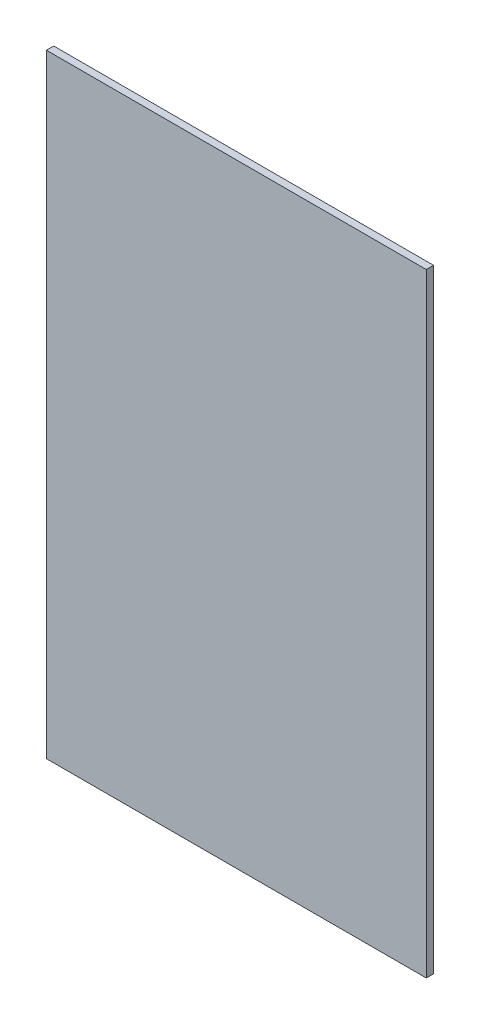
ISO-10303-21;
HEADER;
FILE_DESCRIPTION(('STEP AP214'),'2;1');
FILE_NAME('part.step','',(''),(''),'','','');
FILE_SCHEMA(('AUTOMOTIVE_DESIGN { 1 0 10303 214 1 1 1 1 }'));
ENDSEC;
DATA;
#1=APPLICATION_CONTEXT('core data for automotive mechanical design processes');
#2=APPLICATION_PROTOCOL_DEFINITION('international standard','automotive_design',2000,#1);
#3=PRODUCT_CONTEXT('',#1,'mechanical');
#4=PRODUCT('Part','Part','',(#3));
#5=PRODUCT_RELATED_PRODUCT_CATEGORY('part','',(#4));
#6=PRODUCT_DEFINITION_FORMATION('','',#4);
#7=PRODUCT_DEFINITION_CONTEXT('part definition',#1,'design');
#8=PRODUCT_DEFINITION('design','',#6,#7);
#9=PRODUCT_DEFINITION_SHAPE('','',#8);
#10=(LENGTH_UNIT() NAMED_UNIT(*) SI_UNIT(.MILLI.,.METRE.));
#11=(NAMED_UNIT(*) PLANE_ANGLE_UNIT() SI_UNIT($,.RADIAN.));
#12=(NAMED_UNIT(*) SI_UNIT($,.STERADIAN.) SOLID_ANGLE_UNIT());
#13=UNCERTAINTY_MEASURE_WITH_UNIT(LENGTH_MEASURE(1.E-05),#10,'distance_accuracy_value','');
#14=(GEOMETRIC_REPRESENTATION_CONTEXT(3) GLOBAL_UNCERTAINTY_ASSIGNED_CONTEXT((#13)) GLOBAL_UNIT_ASSIGNED_CONTEXT((#10,
#11,#12)) REPRESENTATION_CONTEXT('',''));
#15=CARTESIAN_POINT('',(0.,0.,0.));
#16=DIRECTION('',(0.,0.,1.));
#17=DIRECTION('',(1.,0.,0.));
#18=AXIS2_PLACEMENT_3D('',#15,#16,#17);
#19=CARTESIAN_POINT('',(-18.2266738415251,48.3646767449386,6.35));
#20=DIRECTION('',(1.,0.,0.));
#21=DIRECTION('',(0.,1.,0.));
#22=AXIS2_PLACEMENT_3D('',#19,#20,#21);
#23=PLANE('',#22);
#24=DIRECTION('',(0.,-1.,0.));
#25=VECTOR('',#24,1.);
#26=CARTESIAN_POINT('',(-18.2266738415251,48.3646767449386,0.));
#27=LINE('',#26,#25);
#28=CARTESIAN_POINT('',(-18.2266738415251,48.3646767449386,0.));
#29=VERTEX_POINT('',#28);
#30=CARTESIAN_POINT('',(-18.226673841525,-485.035323255061,0.));
#31=VERTEX_POINT('',#30);
#32=EDGE_CURVE('E98',#29,#31,#27,.T.);
#33=ORIENTED_EDGE('',*,*,#32,.T.);
#34=DIRECTION('',(0.,0.,-1.));
#35=VECTOR('',#34,1.);
#36=CARTESIAN_POINT('',(-18.226673841525,-485.035323255061,6.35));
#37=LINE('',#36,#35);
#38=CARTESIAN_POINT('',(-18.226673841525,-485.035323255061,6.35));
#39=VERTEX_POINT('',#38);
#40=EDGE_CURVE('E11',#39,#31,#37,.T.);
#41=ORIENTED_EDGE('',*,*,#40,.F.);
#42=DIRECTION('',(0.,-1.,0.));
#43=VECTOR('',#42,1.);
#44=CARTESIAN_POINT('',(-18.2266738415251,48.3646767449386,6.35));
#45=LINE('',#44,#43);
#46=CARTESIAN_POINT('',(-18.2266738415251,48.3646767449386,6.35));
#47=VERTEX_POINT('',#46);
#48=EDGE_CURVE('E86',#47,#39,#45,.T.);
#49=ORIENTED_EDGE('',*,*,#48,.F.);
#50=DIRECTION('',(0.,0.,-1.));
#51=VECTOR('',#50,1.);
#52=CARTESIAN_POINT('',(-18.2266738415251,48.3646767449386,6.35));
#53=LINE('',#52,#51);
#54=EDGE_CURVE('E94',#47,#29,#53,.T.);
#55=ORIENTED_EDGE('',*,*,#54,.T.);
#56=EDGE_LOOP('',(#33,#41,#49,#55));
#57=FACE_BOUND('',#56,.T.);
#58=ADVANCED_FACE('F35',(#57),#23,.F.);
#59=CARTESIAN_POINT('',(-18.226673841525,-485.035323255061,6.35));
#60=DIRECTION('',(0.,1.,0.));
#61=DIRECTION('',(0.,0.,1.));
#62=AXIS2_PLACEMENT_3D('',#59,#60,#61);
#63=PLANE('',#62);
#64=DIRECTION('',(1.,0.,0.));
#65=VECTOR('',#64,1.);
#66=CARTESIAN_POINT('',(-18.226673841525,-485.035323255061,0.));
#67=LINE('',#66,#65);
#68=CARTESIAN_POINT('',(311.973326158475,-485.035323255061,0.));
#69=VERTEX_POINT('',#68);
#70=EDGE_CURVE('E90',#31,#69,#67,.T.);
#71=ORIENTED_EDGE('',*,*,#70,.T.);
#72=DIRECTION('',(0.,0.,-1.));
#73=VECTOR('',#72,1.);
#74=CARTESIAN_POINT('',(311.973326158475,-485.035323255061,6.35));
#75=LINE('',#74,#73);
#76=CARTESIAN_POINT('',(311.973326158475,-485.035323255061,6.35));
#77=VERTEX_POINT('',#76);
#78=EDGE_CURVE('E43',#77,#69,#75,.T.);
#79=ORIENTED_EDGE('',*,*,#78,.F.);
#80=DIRECTION('',(1.,0.,0.));
#81=VECTOR('',#80,1.);
#82=CARTESIAN_POINT('',(-18.226673841525,-485.035323255061,6.35));
#83=LINE('',#82,#81);
#84=EDGE_CURVE('E81',#39,#77,#83,.T.);
#85=ORIENTED_EDGE('',*,*,#84,.F.);
#86=ORIENTED_EDGE('',*,*,#40,.T.);
#87=EDGE_LOOP('',(#71,#79,#85,#86));
#88=FACE_BOUND('',#87,.T.);
#89=ADVANCED_FACE('F89',(#88),#63,.F.);
#90=CARTESIAN_POINT('',(311.973326158475,48.3646767449386,6.35));
#91=DIRECTION('',(-1.,0.,0.));
#92=DIRECTION('',(0.,-1.,0.));
#93=AXIS2_PLACEMENT_3D('',#90,#91,#92);
#94=PLANE('',#93);
#95=DIRECTION('',(0.,1.,0.));
#96=VECTOR('',#95,1.);
#97=CARTESIAN_POINT('',(311.973326158475,48.3646767449386,0.));
#98=LINE('',#97,#96);
#99=CARTESIAN_POINT('',(311.973326158475,48.3646767449386,0.));
#100=VERTEX_POINT('',#99);
#101=EDGE_CURVE('E68',#69,#100,#98,.T.);
#102=ORIENTED_EDGE('',*,*,#101,.T.);
#103=DIRECTION('',(0.,0.,-1.));
#104=VECTOR('',#103,1.);
#105=CARTESIAN_POINT('',(311.973326158475,48.3646767449386,6.35));
#106=LINE('',#105,#104);
#107=CARTESIAN_POINT('',(311.973326158475,48.3646767449386,6.35));
#108=VERTEX_POINT('',#107);
#109=EDGE_CURVE('E91',#108,#100,#106,.T.);
#110=ORIENTED_EDGE('',*,*,#109,.F.);
#111=DIRECTION('',(0.,1.,0.));
#112=VECTOR('',#111,1.);
#113=CARTESIAN_POINT('',(311.973326158475,48.3646767449386,6.35));
#114=LINE('',#113,#112);
#115=EDGE_CURVE('E84',#77,#108,#114,.T.);
#116=ORIENTED_EDGE('',*,*,#115,.F.);
#117=ORIENTED_EDGE('',*,*,#78,.T.);
#118=EDGE_LOOP('',(#102,#110,#116,#117));
#119=FACE_BOUND('',#118,.T.);
#120=ADVANCED_FACE('F92',(#119),#94,.F.);
#121=CARTESIAN_POINT('',(-18.2266738415251,48.3646767449386,6.35));
#122=DIRECTION('',(0.,-1.,0.));
#123=DIRECTION('',(0.,0.,-1.));
#124=AXIS2_PLACEMENT_3D('',#121,#122,#123);
#125=PLANE('',#124);
#126=DIRECTION('',(-1.,0.,0.));
#127=VECTOR('',#126,1.);
#128=CARTESIAN_POINT('',(-18.2266738415251,48.3646767449386,0.));
#129=LINE('',#128,#127);
#130=EDGE_CURVE('E74',#100,#29,#129,.T.);
#131=ORIENTED_EDGE('',*,*,#130,.T.);
#132=ORIENTED_EDGE('',*,*,#54,.F.);
#133=DIRECTION('',(-1.,0.,0.));
#134=VECTOR('',#133,1.);
#135=CARTESIAN_POINT('',(-18.2266738415251,48.3646767449386,6.35));
#136=LINE('',#135,#134);
#137=EDGE_CURVE('E51',#108,#47,#136,.T.);
#138=ORIENTED_EDGE('',*,*,#137,.F.);
#139=ORIENTED_EDGE('',*,*,#109,.T.);
#140=EDGE_LOOP('',(#131,#132,#138,#139));
#141=FACE_BOUND('',#140,.T.);
#142=ADVANCED_FACE('F105',(#141),#125,.F.);
#143=CARTESIAN_POINT('',(0.,0.,6.35));
#144=DIRECTION('',(0.,0.,1.));
#145=DIRECTION('',(1.,0.,0.));
#146=AXIS2_PLACEMENT_3D('',#143,#144,#145);
#147=PLANE('',#146);
#148=ORIENTED_EDGE('',*,*,#48,.T.);
#149=ORIENTED_EDGE('',*,*,#84,.T.);
#150=ORIENTED_EDGE('',*,*,#115,.T.);
#151=ORIENTED_EDGE('',*,*,#137,.T.);
#152=EDGE_LOOP('',(#148,#149,#150,#151));
#153=FACE_BOUND('',#152,.T.);
#154=ADVANCED_FACE('F82',(#153),#147,.T.);
#155=CARTESIAN_POINT('',(0.,0.,0.));
#156=DIRECTION('',(0.,0.,1.));
#157=DIRECTION('',(1.,0.,0.));
#158=AXIS2_PLACEMENT_3D('',#155,#156,#157);
#159=PLANE('',#158);
#160=ORIENTED_EDGE('',*,*,#32,.F.);
#161=ORIENTED_EDGE('',*,*,#130,.F.);
#162=ORIENTED_EDGE('',*,*,#101,.F.);
#163=ORIENTED_EDGE('',*,*,#70,.F.);
#164=EDGE_LOOP('',(#160,#161,#162,#163));
#165=FACE_BOUND('',#164,.T.);
#166=ADVANCED_FACE('F108',(#165),#159,.F.);
#167=CLOSED_SHELL('',(#58,#89,#120,#142,#154,#166));
#168=MANIFOLD_SOLID_BREP('B2',#167);
#169=ADVANCED_BREP_SHAPE_REPRESENTATION('',(#18,#168),#14);
#170=SHAPE_DEFINITION_REPRESENTATION(#9,#169);
ENDSEC;
END-ISO-10303-21;
